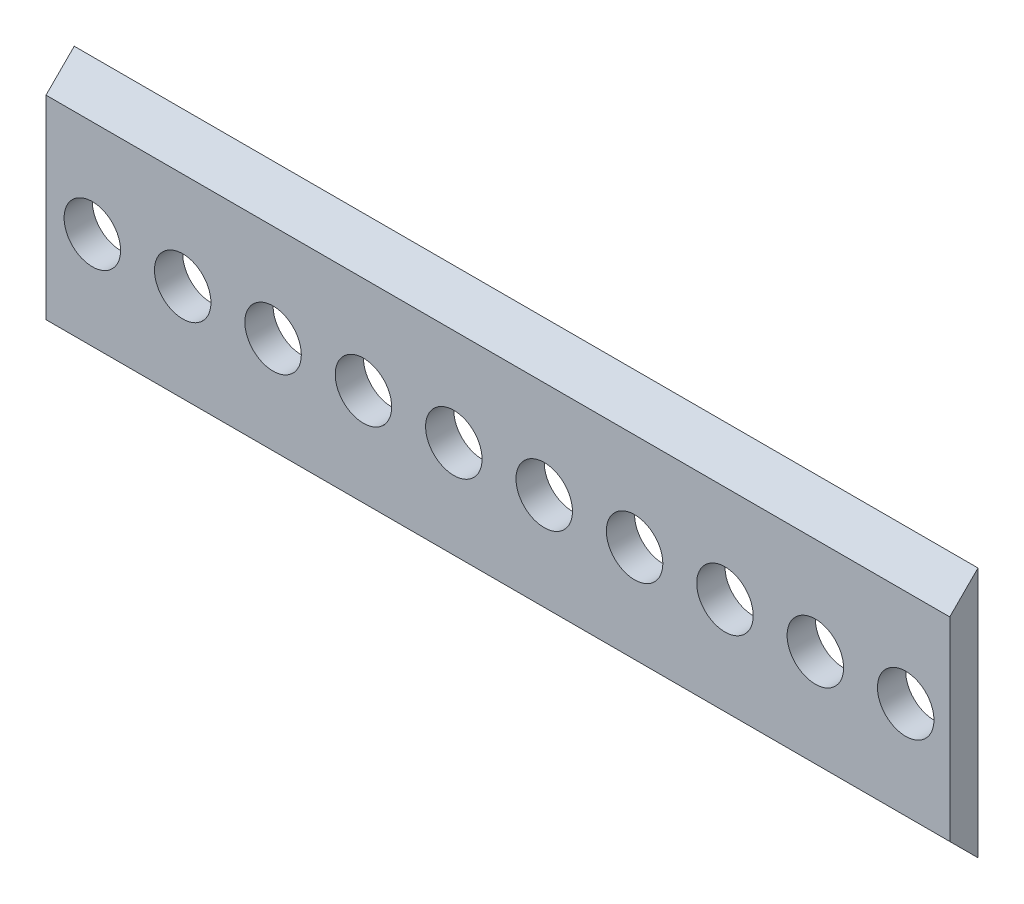
ISO-10303-21;
HEADER;
FILE_DESCRIPTION(('STEP AP214'),'2;1');
FILE_NAME('part.step','',(''),(''),'','','');
FILE_SCHEMA(('AUTOMOTIVE_DESIGN { 1 0 10303 214 1 1 1 1 }'));
ENDSEC;
DATA;
#1=APPLICATION_CONTEXT('core data for automotive mechanical design processes');
#2=APPLICATION_PROTOCOL_DEFINITION('international standard','automotive_design',2000,#1);
#3=PRODUCT_CONTEXT('',#1,'mechanical');
#4=PRODUCT('Part','Part','',(#3));
#5=PRODUCT_RELATED_PRODUCT_CATEGORY('part','',(#4));
#6=PRODUCT_DEFINITION_FORMATION('','',#4);
#7=PRODUCT_DEFINITION_CONTEXT('part definition',#1,'design');
#8=PRODUCT_DEFINITION('design','',#6,#7);
#9=PRODUCT_DEFINITION_SHAPE('','',#8);
#10=(LENGTH_UNIT() NAMED_UNIT(*) SI_UNIT(.MILLI.,.METRE.));
#11=(NAMED_UNIT(*) PLANE_ANGLE_UNIT() SI_UNIT($,.RADIAN.));
#12=(NAMED_UNIT(*) SI_UNIT($,.STERADIAN.) SOLID_ANGLE_UNIT());
#13=UNCERTAINTY_MEASURE_WITH_UNIT(LENGTH_MEASURE(1.E-05),#10,'distance_accuracy_value','');
#14=(GEOMETRIC_REPRESENTATION_CONTEXT(3) GLOBAL_UNCERTAINTY_ASSIGNED_CONTEXT((#13)) GLOBAL_UNIT_ASSIGNED_CONTEXT((#10,
#11,#12)) REPRESENTATION_CONTEXT('',''));
#15=CARTESIAN_POINT('',(0.,0.,0.));
#16=DIRECTION('',(0.,0.,1.));
#17=DIRECTION('',(1.,0.,0.));
#18=AXIS2_PLACEMENT_3D('',#15,#16,#17);
#19=CARTESIAN_POINT('',(101.6,0.,3.175));
#20=DIRECTION('',(-1.,0.,0.));
#21=DIRECTION('',(0.,0.,1.));
#22=AXIS2_PLACEMENT_3D('',#19,#20,#21);
#23=PLANE('',#22);
#24=DIRECTION('',(0.,1.,0.));
#25=VECTOR('',#24,1.);
#26=CARTESIAN_POINT('',(101.6,0.,3.175));
#27=LINE('',#26,#25);
#28=CARTESIAN_POINT('',(101.6,3.17500000000001,3.175));
#29=VERTEX_POINT('',#28);
#30=CARTESIAN_POINT('',(101.6,25.040251418,3.175));
#31=VERTEX_POINT('',#30);
#32=EDGE_CURVE('E119',#29,#31,#27,.T.);
#33=ORIENTED_EDGE('',*,*,#32,.F.);
#34=DIRECTION('',(0.,-0.707106781186546,-0.707106781186549));
#35=VECTOR('',#34,1.);
#36=CARTESIAN_POINT('',(101.6,3.17500000000001,3.175));
#37=LINE('',#36,#35);
#38=CARTESIAN_POINT('',(101.6,0.,0.));
#39=VERTEX_POINT('',#38);
#40=EDGE_CURVE('E99',#29,#39,#37,.T.);
#41=ORIENTED_EDGE('',*,*,#40,.T.);
#42=DIRECTION('',(0.,1.,0.));
#43=VECTOR('',#42,1.);
#44=CARTESIAN_POINT('',(101.6,0.,0.));
#45=LINE('',#44,#43);
#46=CARTESIAN_POINT('',(101.6,28.215251418,0.));
#47=VERTEX_POINT('',#46);
#48=EDGE_CURVE('E89',#39,#47,#45,.T.);
#49=ORIENTED_EDGE('',*,*,#48,.T.);
#50=DIRECTION('',(0.,-0.707106781186548,0.707106781186548));
#51=VECTOR('',#50,1.);
#52=CARTESIAN_POINT('',(101.6,25.040251418,3.17500000000001));
#53=LINE('',#52,#51);
#54=EDGE_CURVE('E97',#47,#31,#53,.T.);
#55=ORIENTED_EDGE('',*,*,#54,.T.);
#56=EDGE_LOOP('',(#33,#41,#49,#55));
#57=FACE_BOUND('',#56,.T.);
#58=ADVANCED_FACE('F43',(#57),#23,.F.);
#59=CARTESIAN_POINT('',(0.,0.,3.175));
#60=DIRECTION('',(1.,0.,0.));
#61=DIRECTION('',(0.,0.,-1.));
#62=AXIS2_PLACEMENT_3D('',#59,#60,#61);
#63=PLANE('',#62);
#64=DIRECTION('',(0.,-1.,0.));
#65=VECTOR('',#64,1.);
#66=CARTESIAN_POINT('',(0.,0.,0.));
#67=LINE('',#66,#65);
#68=CARTESIAN_POINT('',(0.,28.215251418,0.));
#69=VERTEX_POINT('',#68);
#70=CARTESIAN_POINT('',(0.,0.,0.));
#71=VERTEX_POINT('',#70);
#72=EDGE_CURVE('E91',#69,#71,#67,.T.);
#73=ORIENTED_EDGE('',*,*,#72,.T.);
#74=DIRECTION('',(0.,0.707106781186546,0.707106781186549));
#75=VECTOR('',#74,1.);
#76=CARTESIAN_POINT('',(0.,3.17500000000001,3.175));
#77=LINE('',#76,#75);
#78=CARTESIAN_POINT('',(0.,3.17500000000001,3.175));
#79=VERTEX_POINT('',#78);
#80=EDGE_CURVE('E11',#71,#79,#77,.T.);
#81=ORIENTED_EDGE('',*,*,#80,.T.);
#82=DIRECTION('',(0.,-1.,0.));
#83=VECTOR('',#82,1.);
#84=CARTESIAN_POINT('',(0.,0.,3.175));
#85=LINE('',#84,#83);
#86=CARTESIAN_POINT('',(0.,25.040251418,3.175));
#87=VERTEX_POINT('',#86);
#88=EDGE_CURVE('E115',#87,#79,#85,.T.);
#89=ORIENTED_EDGE('',*,*,#88,.F.);
#90=DIRECTION('',(0.,0.707106781186548,-0.707106781186548));
#91=VECTOR('',#90,1.);
#92=CARTESIAN_POINT('',(0.,25.040251418,3.175));
#93=LINE('',#92,#91);
#94=EDGE_CURVE('E53',#87,#69,#93,.T.);
#95=ORIENTED_EDGE('',*,*,#94,.T.);
#96=EDGE_LOOP('',(#73,#81,#89,#95));
#97=FACE_BOUND('',#96,.T.);
#98=ADVANCED_FACE('F114',(#97),#63,.F.);
#99=CARTESIAN_POINT('',(5.20763360044749,14.107625709,3.175));
#100=DIRECTION('',(0.,0.,-1.));
#101=DIRECTION('',(-1.,0.,0.));
#102=AXIS2_PLACEMENT_3D('',#99,#100,#101);
#103=CYLINDRICAL_SURFACE('',#102,3.175);
#104=CARTESIAN_POINT('',(5.20763360044749,14.107625709,3.175));
#105=DIRECTION('',(0.,0.,1.));
#106=DIRECTION('',(1.,0.,0.));
#107=AXIS2_PLACEMENT_3D('',#104,#105,#106);
#108=CIRCLE('',#107,3.175);
#109=CARTESIAN_POINT('',(8.38263360044749,14.107625709,3.175));
#110=VERTEX_POINT('',#109);
#111=EDGE_CURVE('E123',#110,#110,#108,.T.);
#112=ORIENTED_EDGE('',*,*,#111,.T.);
#113=EDGE_LOOP('',(#112));
#114=FACE_BOUND('',#113,.T.);
#115=CARTESIAN_POINT('',(5.20763360044749,14.107625709,0.));
#116=DIRECTION('',(0.,0.,1.));
#117=DIRECTION('',(1.,0.,0.));
#118=AXIS2_PLACEMENT_3D('',#115,#116,#117);
#119=CIRCLE('',#118,3.175);
#120=CARTESIAN_POINT('',(8.38263360044749,14.107625709,0.));
#121=VERTEX_POINT('',#120);
#122=EDGE_CURVE('E101',#121,#121,#119,.T.);
#123=ORIENTED_EDGE('',*,*,#122,.F.);
#124=EDGE_LOOP('',(#123));
#125=FACE_BOUND('',#124,.T.);
#126=ADVANCED_FACE('F213',(#114,#125),#103,.F.);
#127=CARTESIAN_POINT('',(15.3676336004475,14.107625709,3.175));
#128=DIRECTION('',(0.,0.,-1.));
#129=DIRECTION('',(-1.,0.,0.));
#130=AXIS2_PLACEMENT_3D('',#127,#128,#129);
#131=CYLINDRICAL_SURFACE('',#130,3.175);
#132=CARTESIAN_POINT('',(15.3676336004475,14.107625709,3.175));
#133=DIRECTION('',(0.,0.,1.));
#134=DIRECTION('',(1.,0.,0.));
#135=AXIS2_PLACEMENT_3D('',#132,#133,#134);
#136=CIRCLE('',#135,3.175);
#137=CARTESIAN_POINT('',(18.5426336004475,14.107625709,3.175));
#138=VERTEX_POINT('',#137);
#139=EDGE_CURVE('E206',#138,#138,#136,.T.);
#140=ORIENTED_EDGE('',*,*,#139,.T.);
#141=EDGE_LOOP('',(#140));
#142=FACE_BOUND('',#141,.T.);
#143=CARTESIAN_POINT('',(15.3676336004475,14.107625709,0.));
#144=DIRECTION('',(0.,0.,1.));
#145=DIRECTION('',(1.,0.,0.));
#146=AXIS2_PLACEMENT_3D('',#143,#144,#145);
#147=CIRCLE('',#146,3.175);
#148=CARTESIAN_POINT('',(18.5426336004475,14.107625709,0.));
#149=VERTEX_POINT('',#148);
#150=EDGE_CURVE('E159',#149,#149,#147,.T.);
#151=ORIENTED_EDGE('',*,*,#150,.F.);
#152=EDGE_LOOP('',(#151));
#153=FACE_BOUND('',#152,.T.);
#154=ADVANCED_FACE('F240',(#142,#153),#131,.F.);
#155=CARTESIAN_POINT('',(25.5276336004475,14.107625709,3.175));
#156=DIRECTION('',(0.,0.,-1.));
#157=DIRECTION('',(-1.,0.,0.));
#158=AXIS2_PLACEMENT_3D('',#155,#156,#157);
#159=CYLINDRICAL_SURFACE('',#158,3.175);
#160=CARTESIAN_POINT('',(25.5276336004475,14.107625709,3.175));
#161=DIRECTION('',(0.,0.,1.));
#162=DIRECTION('',(1.,0.,0.));
#163=AXIS2_PLACEMENT_3D('',#160,#161,#162);
#164=CIRCLE('',#163,3.175);
#165=CARTESIAN_POINT('',(28.7026336004475,14.107625709,3.175));
#166=VERTEX_POINT('',#165);
#167=EDGE_CURVE('E202',#166,#166,#164,.T.);
#168=ORIENTED_EDGE('',*,*,#167,.T.);
#169=EDGE_LOOP('',(#168));
#170=FACE_BOUND('',#169,.T.);
#171=CARTESIAN_POINT('',(25.5276336004475,14.107625709,0.));
#172=DIRECTION('',(0.,0.,1.));
#173=DIRECTION('',(1.,0.,0.));
#174=AXIS2_PLACEMENT_3D('',#171,#172,#173);
#175=CIRCLE('',#174,3.175);
#176=CARTESIAN_POINT('',(28.7026336004475,14.107625709,0.));
#177=VERTEX_POINT('',#176);
#178=EDGE_CURVE('E155',#177,#177,#175,.T.);
#179=ORIENTED_EDGE('',*,*,#178,.F.);
#180=EDGE_LOOP('',(#179));
#181=FACE_BOUND('',#180,.T.);
#182=ADVANCED_FACE('F243',(#170,#181),#159,.F.);
#183=CARTESIAN_POINT('',(35.6876336004475,14.107625709,3.175));
#184=DIRECTION('',(0.,0.,-1.));
#185=DIRECTION('',(-1.,0.,0.));
#186=AXIS2_PLACEMENT_3D('',#183,#184,#185);
#187=CYLINDRICAL_SURFACE('',#186,3.175);
#188=CARTESIAN_POINT('',(35.6876336004475,14.107625709,3.175));
#189=DIRECTION('',(0.,0.,1.));
#190=DIRECTION('',(1.,0.,0.));
#191=AXIS2_PLACEMENT_3D('',#188,#189,#190);
#192=CIRCLE('',#191,3.175);
#193=CARTESIAN_POINT('',(38.8626336004475,14.107625709,3.175));
#194=VERTEX_POINT('',#193);
#195=EDGE_CURVE('E198',#194,#194,#192,.T.);
#196=ORIENTED_EDGE('',*,*,#195,.T.);
#197=EDGE_LOOP('',(#196));
#198=FACE_BOUND('',#197,.T.);
#199=CARTESIAN_POINT('',(35.6876336004475,14.107625709,0.));
#200=DIRECTION('',(0.,0.,1.));
#201=DIRECTION('',(1.,0.,0.));
#202=AXIS2_PLACEMENT_3D('',#199,#200,#201);
#203=CIRCLE('',#202,3.175);
#204=CARTESIAN_POINT('',(38.8626336004475,14.107625709,0.));
#205=VERTEX_POINT('',#204);
#206=EDGE_CURVE('E151',#205,#205,#203,.T.);
#207=ORIENTED_EDGE('',*,*,#206,.F.);
#208=EDGE_LOOP('',(#207));
#209=FACE_BOUND('',#208,.T.);
#210=ADVANCED_FACE('F247',(#198,#209),#187,.F.);
#211=CARTESIAN_POINT('',(45.8476336004475,14.107625709,3.175));
#212=DIRECTION('',(0.,0.,-1.));
#213=DIRECTION('',(-1.,0.,0.));
#214=AXIS2_PLACEMENT_3D('',#211,#212,#213);
#215=CYLINDRICAL_SURFACE('',#214,3.175);
#216=CARTESIAN_POINT('',(45.8476336004475,14.107625709,3.175));
#217=DIRECTION('',(0.,0.,1.));
#218=DIRECTION('',(1.,0.,0.));
#219=AXIS2_PLACEMENT_3D('',#216,#217,#218);
#220=CIRCLE('',#219,3.175);
#221=CARTESIAN_POINT('',(49.0226336004475,14.107625709,3.175));
#222=VERTEX_POINT('',#221);
#223=EDGE_CURVE('E194',#222,#222,#220,.T.);
#224=ORIENTED_EDGE('',*,*,#223,.T.);
#225=EDGE_LOOP('',(#224));
#226=FACE_BOUND('',#225,.T.);
#227=CARTESIAN_POINT('',(45.8476336004475,14.107625709,0.));
#228=DIRECTION('',(0.,0.,1.));
#229=DIRECTION('',(1.,0.,0.));
#230=AXIS2_PLACEMENT_3D('',#227,#228,#229);
#231=CIRCLE('',#230,3.175);
#232=CARTESIAN_POINT('',(49.0226336004475,14.107625709,0.));
#233=VERTEX_POINT('',#232);
#234=EDGE_CURVE('E147',#233,#233,#231,.T.);
#235=ORIENTED_EDGE('',*,*,#234,.F.);
#236=EDGE_LOOP('',(#235));
#237=FACE_BOUND('',#236,.T.);
#238=ADVANCED_FACE('F251',(#226,#237),#215,.F.);
#239=CARTESIAN_POINT('',(56.0076336004475,14.107625709,3.175));
#240=DIRECTION('',(0.,0.,-1.));
#241=DIRECTION('',(-1.,0.,0.));
#242=AXIS2_PLACEMENT_3D('',#239,#240,#241);
#243=CYLINDRICAL_SURFACE('',#242,3.175);
#244=CARTESIAN_POINT('',(56.0076336004475,14.107625709,3.175));
#245=DIRECTION('',(0.,0.,1.));
#246=DIRECTION('',(1.,0.,0.));
#247=AXIS2_PLACEMENT_3D('',#244,#245,#246);
#248=CIRCLE('',#247,3.175);
#249=CARTESIAN_POINT('',(59.1826336004475,14.107625709,3.175));
#250=VERTEX_POINT('',#249);
#251=EDGE_CURVE('E190',#250,#250,#248,.T.);
#252=ORIENTED_EDGE('',*,*,#251,.T.);
#253=EDGE_LOOP('',(#252));
#254=FACE_BOUND('',#253,.T.);
#255=CARTESIAN_POINT('',(56.0076336004475,14.107625709,0.));
#256=DIRECTION('',(0.,0.,1.));
#257=DIRECTION('',(1.,0.,0.));
#258=AXIS2_PLACEMENT_3D('',#255,#256,#257);
#259=CIRCLE('',#258,3.175);
#260=CARTESIAN_POINT('',(59.1826336004475,14.107625709,0.));
#261=VERTEX_POINT('',#260);
#262=EDGE_CURVE('E143',#261,#261,#259,.T.);
#263=ORIENTED_EDGE('',*,*,#262,.F.);
#264=EDGE_LOOP('',(#263));
#265=FACE_BOUND('',#264,.T.);
#266=ADVANCED_FACE('F255',(#254,#265),#243,.F.);
#267=CARTESIAN_POINT('',(66.1676336004475,14.107625709,3.175));
#268=DIRECTION('',(0.,0.,-1.));
#269=DIRECTION('',(-1.,0.,0.));
#270=AXIS2_PLACEMENT_3D('',#267,#268,#269);
#271=CYLINDRICAL_SURFACE('',#270,3.175);
#272=CARTESIAN_POINT('',(66.1676336004475,14.107625709,3.175));
#273=DIRECTION('',(0.,0.,1.));
#274=DIRECTION('',(1.,0.,0.));
#275=AXIS2_PLACEMENT_3D('',#272,#273,#274);
#276=CIRCLE('',#275,3.175);
#277=CARTESIAN_POINT('',(69.3426336004475,14.107625709,3.175));
#278=VERTEX_POINT('',#277);
#279=EDGE_CURVE('E186',#278,#278,#276,.T.);
#280=ORIENTED_EDGE('',*,*,#279,.T.);
#281=EDGE_LOOP('',(#280));
#282=FACE_BOUND('',#281,.T.);
#283=CARTESIAN_POINT('',(66.1676336004475,14.107625709,0.));
#284=DIRECTION('',(0.,0.,1.));
#285=DIRECTION('',(1.,0.,0.));
#286=AXIS2_PLACEMENT_3D('',#283,#284,#285);
#287=CIRCLE('',#286,3.175);
#288=CARTESIAN_POINT('',(69.3426336004475,14.107625709,0.));
#289=VERTEX_POINT('',#288);
#290=EDGE_CURVE('E139',#289,#289,#287,.T.);
#291=ORIENTED_EDGE('',*,*,#290,.F.);
#292=EDGE_LOOP('',(#291));
#293=FACE_BOUND('',#292,.T.);
#294=ADVANCED_FACE('F259',(#282,#293),#271,.F.);
#295=CARTESIAN_POINT('',(76.3276336004475,14.107625709,3.175));
#296=DIRECTION('',(0.,0.,-1.));
#297=DIRECTION('',(-1.,0.,0.));
#298=AXIS2_PLACEMENT_3D('',#295,#296,#297);
#299=CYLINDRICAL_SURFACE('',#298,3.175);
#300=CARTESIAN_POINT('',(76.3276336004475,14.107625709,3.175));
#301=DIRECTION('',(0.,0.,1.));
#302=DIRECTION('',(1.,0.,0.));
#303=AXIS2_PLACEMENT_3D('',#300,#301,#302);
#304=CIRCLE('',#303,3.175);
#305=CARTESIAN_POINT('',(79.5026336004475,14.107625709,3.175));
#306=VERTEX_POINT('',#305);
#307=EDGE_CURVE('E180',#306,#306,#304,.T.);
#308=ORIENTED_EDGE('',*,*,#307,.T.);
#309=EDGE_LOOP('',(#308));
#310=FACE_BOUND('',#309,.T.);
#311=CARTESIAN_POINT('',(76.3276336004475,14.107625709,0.));
#312=DIRECTION('',(0.,0.,1.));
#313=DIRECTION('',(1.,0.,0.));
#314=AXIS2_PLACEMENT_3D('',#311,#312,#313);
#315=CIRCLE('',#314,3.175);
#316=CARTESIAN_POINT('',(79.5026336004475,14.107625709,0.));
#317=VERTEX_POINT('',#316);
#318=EDGE_CURVE('E135',#317,#317,#315,.T.);
#319=ORIENTED_EDGE('',*,*,#318,.F.);
#320=EDGE_LOOP('',(#319));
#321=FACE_BOUND('',#320,.T.);
#322=ADVANCED_FACE('F263',(#310,#321),#299,.F.);
#323=CARTESIAN_POINT('',(86.4876336004475,14.107625709,3.175));
#324=DIRECTION('',(0.,0.,-1.));
#325=DIRECTION('',(-1.,0.,0.));
#326=AXIS2_PLACEMENT_3D('',#323,#324,#325);
#327=CYLINDRICAL_SURFACE('',#326,3.175);
#328=CARTESIAN_POINT('',(86.4876336004475,14.107625709,3.175));
#329=DIRECTION('',(0.,0.,1.));
#330=DIRECTION('',(1.,0.,0.));
#331=AXIS2_PLACEMENT_3D('',#328,#329,#330);
#332=CIRCLE('',#331,3.175);
#333=CARTESIAN_POINT('',(89.6626336004475,14.107625709,3.175));
#334=VERTEX_POINT('',#333);
#335=EDGE_CURVE('E174',#334,#334,#332,.T.);
#336=ORIENTED_EDGE('',*,*,#335,.T.);
#337=EDGE_LOOP('',(#336));
#338=FACE_BOUND('',#337,.T.);
#339=CARTESIAN_POINT('',(86.4876336004475,14.107625709,0.));
#340=DIRECTION('',(0.,0.,1.));
#341=DIRECTION('',(1.,0.,0.));
#342=AXIS2_PLACEMENT_3D('',#339,#340,#341);
#343=CIRCLE('',#342,3.175);
#344=CARTESIAN_POINT('',(89.6626336004475,14.107625709,0.));
#345=VERTEX_POINT('',#344);
#346=EDGE_CURVE('E131',#345,#345,#343,.T.);
#347=ORIENTED_EDGE('',*,*,#346,.F.);
#348=EDGE_LOOP('',(#347));
#349=FACE_BOUND('',#348,.T.);
#350=ADVANCED_FACE('F228',(#338,#349),#327,.F.);
#351=CARTESIAN_POINT('',(96.6476336004475,14.107625709,3.175));
#352=DIRECTION('',(0.,0.,-1.));
#353=DIRECTION('',(-1.,0.,0.));
#354=AXIS2_PLACEMENT_3D('',#351,#352,#353);
#355=CYLINDRICAL_SURFACE('',#354,3.175);
#356=CARTESIAN_POINT('',(96.6476336004475,14.107625709,3.175));
#357=DIRECTION('',(0.,0.,1.));
#358=DIRECTION('',(1.,0.,0.));
#359=AXIS2_PLACEMENT_3D('',#356,#357,#358);
#360=CIRCLE('',#359,3.175);
#361=CARTESIAN_POINT('',(99.8226336004475,14.107625709,3.175));
#362=VERTEX_POINT('',#361);
#363=EDGE_CURVE('E170',#362,#362,#360,.T.);
#364=ORIENTED_EDGE('',*,*,#363,.T.);
#365=EDGE_LOOP('',(#364));
#366=FACE_BOUND('',#365,.T.);
#367=CARTESIAN_POINT('',(96.6476336004475,14.107625709,0.));
#368=DIRECTION('',(0.,0.,1.));
#369=DIRECTION('',(1.,0.,0.));
#370=AXIS2_PLACEMENT_3D('',#367,#368,#369);
#371=CIRCLE('',#370,3.175);
#372=CARTESIAN_POINT('',(99.8226336004475,14.107625709,0.));
#373=VERTEX_POINT('',#372);
#374=EDGE_CURVE('E127',#373,#373,#371,.T.);
#375=ORIENTED_EDGE('',*,*,#374,.F.);
#376=EDGE_LOOP('',(#375));
#377=FACE_BOUND('',#376,.T.);
#378=ADVANCED_FACE('F218',(#366,#377),#355,.F.);
#379=CARTESIAN_POINT('',(0.,0.,3.175));
#380=DIRECTION('',(0.,0.,1.));
#381=DIRECTION('',(1.,0.,0.));
#382=AXIS2_PLACEMENT_3D('',#379,#380,#381);
#383=PLANE('',#382);
#384=ORIENTED_EDGE('',*,*,#363,.F.);
#385=EDGE_LOOP('',(#384));
#386=FACE_BOUND('',#385,.T.);
#387=ORIENTED_EDGE('',*,*,#335,.F.);
#388=EDGE_LOOP('',(#387));
#389=FACE_BOUND('',#388,.T.);
#390=ORIENTED_EDGE('',*,*,#307,.F.);
#391=EDGE_LOOP('',(#390));
#392=FACE_BOUND('',#391,.T.);
#393=ORIENTED_EDGE('',*,*,#279,.F.);
#394=EDGE_LOOP('',(#393));
#395=FACE_BOUND('',#394,.T.);
#396=ORIENTED_EDGE('',*,*,#251,.F.);
#397=EDGE_LOOP('',(#396));
#398=FACE_BOUND('',#397,.T.);
#399=ORIENTED_EDGE('',*,*,#223,.F.);
#400=EDGE_LOOP('',(#399));
#401=FACE_BOUND('',#400,.T.);
#402=ORIENTED_EDGE('',*,*,#195,.F.);
#403=EDGE_LOOP('',(#402));
#404=FACE_BOUND('',#403,.T.);
#405=ORIENTED_EDGE('',*,*,#167,.F.);
#406=EDGE_LOOP('',(#405));
#407=FACE_BOUND('',#406,.T.);
#408=ORIENTED_EDGE('',*,*,#139,.F.);
#409=EDGE_LOOP('',(#408));
#410=FACE_BOUND('',#409,.T.);
#411=ORIENTED_EDGE('',*,*,#111,.F.);
#412=EDGE_LOOP('',(#411));
#413=FACE_BOUND('',#412,.T.);
#414=ORIENTED_EDGE('',*,*,#88,.T.);
#415=DIRECTION('',(1.,0.,0.));
#416=VECTOR('',#415,1.);
#417=CARTESIAN_POINT('',(101.6,3.17500000000001,3.175));
#418=LINE('',#417,#416);
#419=EDGE_CURVE('E105',#79,#29,#418,.T.);
#420=ORIENTED_EDGE('',*,*,#419,.T.);
#421=ORIENTED_EDGE('',*,*,#32,.T.);
#422=DIRECTION('',(-1.,0.,0.));
#423=VECTOR('',#422,1.);
#424=CARTESIAN_POINT('',(0.,25.040251418,3.175));
#425=LINE('',#424,#423);
#426=EDGE_CURVE('E103',#31,#87,#425,.T.);
#427=ORIENTED_EDGE('',*,*,#426,.T.);
#428=EDGE_LOOP('',(#414,#420,#421,#427));
#429=FACE_BOUND('',#428,.T.);
#430=ADVANCED_FACE('F216',(#386,#389,#392,#395,#398,#401,#404,#407,#410,#413,#429),#383,.T.);
#431=CARTESIAN_POINT('',(0.,0.,0.));
#432=DIRECTION('',(0.,0.,1.));
#433=DIRECTION('',(1.,0.,0.));
#434=AXIS2_PLACEMENT_3D('',#431,#432,#433);
#435=PLANE('',#434);
#436=ORIENTED_EDGE('',*,*,#374,.T.);
#437=EDGE_LOOP('',(#436));
#438=FACE_BOUND('',#437,.T.);
#439=ORIENTED_EDGE('',*,*,#346,.T.);
#440=EDGE_LOOP('',(#439));
#441=FACE_BOUND('',#440,.T.);
#442=ORIENTED_EDGE('',*,*,#318,.T.);
#443=EDGE_LOOP('',(#442));
#444=FACE_BOUND('',#443,.T.);
#445=ORIENTED_EDGE('',*,*,#290,.T.);
#446=EDGE_LOOP('',(#445));
#447=FACE_BOUND('',#446,.T.);
#448=ORIENTED_EDGE('',*,*,#262,.T.);
#449=EDGE_LOOP('',(#448));
#450=FACE_BOUND('',#449,.T.);
#451=ORIENTED_EDGE('',*,*,#234,.T.);
#452=EDGE_LOOP('',(#451));
#453=FACE_BOUND('',#452,.T.);
#454=ORIENTED_EDGE('',*,*,#206,.T.);
#455=EDGE_LOOP('',(#454));
#456=FACE_BOUND('',#455,.T.);
#457=ORIENTED_EDGE('',*,*,#178,.T.);
#458=EDGE_LOOP('',(#457));
#459=FACE_BOUND('',#458,.T.);
#460=ORIENTED_EDGE('',*,*,#150,.T.);
#461=EDGE_LOOP('',(#460));
#462=FACE_BOUND('',#461,.T.);
#463=ORIENTED_EDGE('',*,*,#122,.T.);
#464=EDGE_LOOP('',(#463));
#465=FACE_BOUND('',#464,.T.);
#466=ORIENTED_EDGE('',*,*,#48,.F.);
#467=DIRECTION('',(1.,0.,0.));
#468=VECTOR('',#467,1.);
#469=CARTESIAN_POINT('',(0.,0.,0.));
#470=LINE('',#469,#468);
#471=EDGE_CURVE('E168',#71,#39,#470,.T.);
#472=ORIENTED_EDGE('',*,*,#471,.F.);
#473=ORIENTED_EDGE('',*,*,#72,.F.);
#474=DIRECTION('',(-1.,0.,0.));
#475=VECTOR('',#474,1.);
#476=CARTESIAN_POINT('',(0.,28.215251418,0.));
#477=LINE('',#476,#475);
#478=EDGE_CURVE('E85',#47,#69,#477,.T.);
#479=ORIENTED_EDGE('',*,*,#478,.F.);
#480=EDGE_LOOP('',(#466,#472,#473,#479));
#481=FACE_BOUND('',#480,.T.);
#482=ADVANCED_FACE('F87',(#438,#441,#444,#447,#450,#453,#456,#459,#462,#465,#481),#435,.F.);
#483=CARTESIAN_POINT('',(0.,3.17500000000001,3.175));
#484=DIRECTION('',(0.,-0.707106781186549,0.707106781186546));
#485=DIRECTION('',(-1.,0.,0.));
#486=AXIS2_PLACEMENT_3D('',#483,#484,#485);
#487=PLANE('',#486);
#488=ORIENTED_EDGE('',*,*,#80,.F.);
#489=ORIENTED_EDGE('',*,*,#471,.T.);
#490=ORIENTED_EDGE('',*,*,#40,.F.);
#491=ORIENTED_EDGE('',*,*,#419,.F.);
#492=EDGE_LOOP('',(#488,#489,#490,#491));
#493=FACE_BOUND('',#492,.T.);
#494=ADVANCED_FACE('F225',(#493),#487,.T.);
#495=CARTESIAN_POINT('',(0.,25.040251418,3.175));
#496=DIRECTION('',(0.,0.707106781186547,0.707106781186547));
#497=DIRECTION('',(1.,0.,0.));
#498=AXIS2_PLACEMENT_3D('',#495,#496,#497);
#499=PLANE('',#498);
#500=ORIENTED_EDGE('',*,*,#54,.F.);
#501=ORIENTED_EDGE('',*,*,#478,.T.);
#502=ORIENTED_EDGE('',*,*,#94,.F.);
#503=ORIENTED_EDGE('',*,*,#426,.F.);
#504=EDGE_LOOP('',(#500,#501,#502,#503));
#505=FACE_BOUND('',#504,.T.);
#506=ADVANCED_FACE('F46',(#505),#499,.T.);
#507=CLOSED_SHELL('',(#58,#98,#126,#154,#182,#210,#238,#266,#294,#322,#350,#378,#430,#482,#494,#506));
#508=MANIFOLD_SOLID_BREP('B2',#507);
#509=ADVANCED_BREP_SHAPE_REPRESENTATION('',(#18,#508),#14);
#510=SHAPE_DEFINITION_REPRESENTATION(#9,#509);
ENDSEC;
END-ISO-10303-21;
